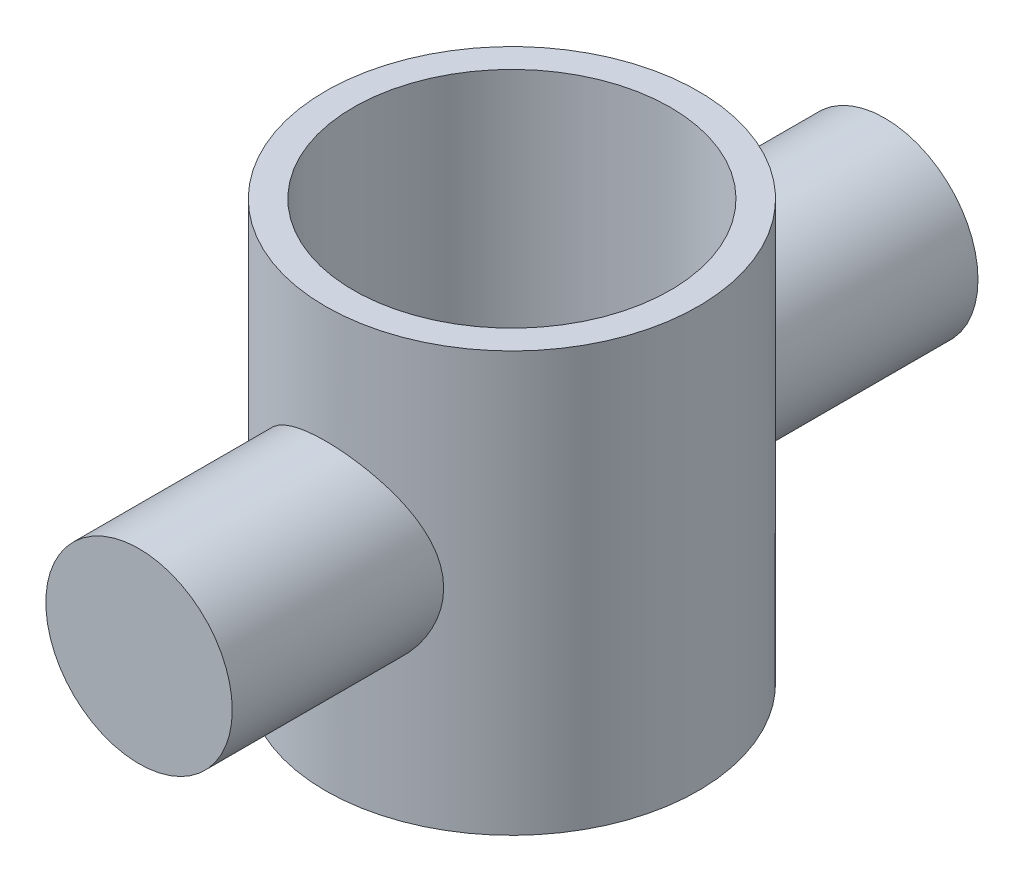
ISO-10303-21;
HEADER;
FILE_DESCRIPTION(('STEP AP214'),'2;1');
FILE_NAME('part.step','',(''),(''),'','','');
FILE_SCHEMA(('AUTOMOTIVE_DESIGN { 1 0 10303 214 1 1 1 1 }'));
ENDSEC;
DATA;
#1=APPLICATION_CONTEXT('core data for automotive mechanical design processes');
#2=APPLICATION_PROTOCOL_DEFINITION('international standard','automotive_design',2000,#1);
#3=PRODUCT_CONTEXT('',#1,'mechanical');
#4=PRODUCT('Part','Part','',(#3));
#5=PRODUCT_RELATED_PRODUCT_CATEGORY('part','',(#4));
#6=PRODUCT_DEFINITION_FORMATION('','',#4);
#7=PRODUCT_DEFINITION_CONTEXT('part definition',#1,'design');
#8=PRODUCT_DEFINITION('design','',#6,#7);
#9=PRODUCT_DEFINITION_SHAPE('','',#8);
#10=(LENGTH_UNIT() NAMED_UNIT(*) SI_UNIT(.MILLI.,.METRE.));
#11=(NAMED_UNIT(*) PLANE_ANGLE_UNIT() SI_UNIT($,.RADIAN.));
#12=(NAMED_UNIT(*) SI_UNIT($,.STERADIAN.) SOLID_ANGLE_UNIT());
#13=UNCERTAINTY_MEASURE_WITH_UNIT(LENGTH_MEASURE(1.E-05),#10,'distance_accuracy_value','');
#14=(GEOMETRIC_REPRESENTATION_CONTEXT(3) GLOBAL_UNCERTAINTY_ASSIGNED_CONTEXT((#13)) GLOBAL_UNIT_ASSIGNED_CONTEXT((#10,
#11,#12)) REPRESENTATION_CONTEXT('',''));
#15=CARTESIAN_POINT('',(0.,0.,0.));
#16=DIRECTION('',(0.,0.,1.));
#17=DIRECTION('',(1.,0.,0.));
#18=AXIS2_PLACEMENT_3D('',#15,#16,#17);
#19=CARTESIAN_POINT('',(0.,45.,0.));
#20=DIRECTION('',(0.,-1.,0.));
#21=DIRECTION('',(0.,0.,-1.));
#22=AXIS2_PLACEMENT_3D('',#19,#20,#21);
#23=CYLINDRICAL_SURFACE('',#22,20.);
#24=CARTESIAN_POINT('',(0.,0.,0.));
#25=DIRECTION('',(0.,1.,0.));
#26=DIRECTION('',(0.,0.,1.));
#27=AXIS2_PLACEMENT_3D('',#24,#25,#26);
#28=CIRCLE('',#27,20.);
#29=CARTESIAN_POINT('',(0.,0.,20.));
#30=VERTEX_POINT('',#29);
#31=EDGE_CURVE('E51',#30,#30,#28,.T.);
#32=ORIENTED_EDGE('',*,*,#31,.T.);
#33=EDGE_LOOP('',(#32));
#34=FACE_BOUND('',#33,.T.);
#35=CARTESIAN_POINT('',(0.,45.,0.));
#36=DIRECTION('',(0.,1.,0.));
#37=DIRECTION('',(0.,0.,1.));
#38=AXIS2_PLACEMENT_3D('',#35,#36,#37);
#39=CIRCLE('',#38,20.);
#40=CARTESIAN_POINT('',(0.,45.,20.));
#41=VERTEX_POINT('',#40);
#42=EDGE_CURVE('E47',#41,#41,#39,.T.);
#43=ORIENTED_EDGE('',*,*,#42,.F.);
#44=EDGE_LOOP('',(#43));
#45=FACE_BOUND('',#44,.T.);
#46=CARTESIAN_POINT('',(10.,22.5,17.3205080758025));
#47=CARTESIAN_POINT('',(9.99999887830497,22.7606630406052,17.3205095703916));
#48=CARTESIAN_POINT('',(9.98979463038328,23.0213487765862,17.326412410948));
#49=CARTESIAN_POINT('',(9.9491112521575,23.5407114771179,17.3498046872366));
#50=CARTESIAN_POINT('',(9.91862268285056,23.7993874497357,17.3672995171105));
#51=CARTESIAN_POINT('',(9.83771551508335,24.3130233815053,17.4132568469148));
#52=CARTESIAN_POINT('',(9.78726564599209,24.5679768562016,17.4417365535751));
#53=CARTESIAN_POINT('',(9.66704369384655,25.0720498819834,17.5086546907083));
#54=CARTESIAN_POINT('',(9.59726323891524,25.3211668545254,17.5470974356042));
#55=CARTESIAN_POINT('',(9.43962165536858,25.8104736808939,17.6323996319544));
#56=CARTESIAN_POINT('',(9.3518675445972,26.0507068685696,17.6792090659464));
#57=CARTESIAN_POINT('',(9.1588244034212,26.522554226848,17.7799827411094));
#58=CARTESIAN_POINT('',(9.05352901444222,26.7541652345949,17.8339495753296));
#59=CARTESIAN_POINT('',(8.82628481748421,27.2075453910227,17.947501727548));
#60=CARTESIAN_POINT('',(8.70433993726026,27.4293168446367,18.0070857193883));
#61=CARTESIAN_POINT('',(8.44458163827554,27.862159667343,18.1303531605038));
#62=CARTESIAN_POINT('',(8.3067676970442,28.073230683806,18.1940367447229));
#63=CARTESIAN_POINT('',(8.00400718236378,28.5008375300898,18.3293639025618));
#64=CARTESIAN_POINT('',(7.83775940313324,28.7163824929749,18.4012302839659));
#65=CARTESIAN_POINT('',(7.48852658774143,29.1329349102263,18.5460965168987));
#66=CARTESIAN_POINT('',(7.30554585568077,29.3339460793307,18.6190960729602));
#67=CARTESIAN_POINT('',(6.92354675195101,29.7206945636853,18.7644955635839));
#68=CARTESIAN_POINT('',(6.72451542441946,29.9064192905601,18.8368949606593));
#69=CARTESIAN_POINT('',(6.31154503654925,30.2613467831365,18.9792540720519));
#70=CARTESIAN_POINT('',(6.09761130142216,30.4305553993141,19.0492146445835));
#71=CARTESIAN_POINT('',(5.64077435797255,30.7623641319125,19.1896470662405));
#72=CARTESIAN_POINT('',(5.39689043751351,30.923739252636,19.2598322512793));
#73=CARTESIAN_POINT('',(4.89454568058587,31.2252065641405,19.3935808273393));
#74=CARTESIAN_POINT('',(4.63608400823326,31.3652975327898,19.457143838051));
#75=CARTESIAN_POINT('',(4.10635184713668,31.6227489252018,19.5757886087393));
#76=CARTESIAN_POINT('',(3.83508764837286,31.740120369577,19.6308744780711));
#77=CARTESIAN_POINT('',(3.28159286611869,31.9508629769494,19.7309453282133));
#78=CARTESIAN_POINT('',(2.99936345111385,32.0442366891839,19.7759313818453));
#79=CARTESIAN_POINT('',(2.44661617021399,32.2000287759103,19.851606101471));
#80=CARTESIAN_POINT('',(2.17669338786953,32.2641767012523,19.8830841882945));
#81=CARTESIAN_POINT('',(1.63143316165859,32.3699306679204,19.9352303439006));
#82=CARTESIAN_POINT('',(1.35609595374903,32.4115376893174,19.9558988826774));
#83=CARTESIAN_POINT('',(0.802434144208415,32.4716398194173,19.9858180043392));
#84=CARTESIAN_POINT('',(0.524111137986273,32.4901467059472,19.9950744057832));
#85=CARTESIAN_POINT('',(-0.0332441550594182,32.5038286268049,20.001913600906));
#86=CARTESIAN_POINT('',(-0.312276397444165,32.4990050886084,19.9994971087925));
#87=CARTESIAN_POINT('',(-0.844365378168994,32.4675360431046,19.9837839047871));
#88=CARTESIAN_POINT('',(-1.09756809882324,32.4428274531722,19.9714530082894));
#89=CARTESIAN_POINT('',(-1.60072224443297,32.3743173771119,19.9374335863614));
#90=CARTESIAN_POINT('',(-1.85067389701525,32.3305172351899,19.9157457197417));
#91=CARTESIAN_POINT('',(-2.34564683759178,32.2243003885798,19.8635314520883));
#92=CARTESIAN_POINT('',(-2.59066796469637,32.1618830774367,19.8330047631306));
#93=CARTESIAN_POINT('',(-3.07423071170265,32.0190690101673,19.7638249456652));
#94=CARTESIAN_POINT('',(-3.31277209853237,31.9386716082669,19.7251715252803));
#95=CARTESIAN_POINT('',(-3.78519130199608,31.7594279438287,19.6400278970963));
#96=CARTESIAN_POINT('',(-4.01896179864799,31.66034597564,19.5934383954162));
#97=CARTESIAN_POINT('',(-4.47722728597148,31.4453098003851,19.4938328204594));
#98=CARTESIAN_POINT('',(-4.70171895242548,31.3293496126871,19.4408144702995));
#99=CARTESIAN_POINT('',(-5.35951935177887,30.9574852859863,19.2738101334535));
#100=CARTESIAN_POINT('',(-5.77743819794035,30.6774883890319,19.1518214470862));
#101=CARTESIAN_POINT('',(-6.60185513585948,30.0309599928516,18.8844067887008));
#102=CARTESIAN_POINT('',(-7.00353936957576,29.6587504953409,18.7378553722978));
#103=CARTESIAN_POINT('',(-7.55658054219876,29.0553615827988,18.5185765182006));
#104=CARTESIAN_POINT('',(-7.73279224462675,28.8465480347862,18.4455210194467));
#105=CARTESIAN_POINT('',(-8.06791510127875,28.4146773262632,18.301419633553));
#106=CARTESIAN_POINT('',(-8.22682364113361,28.1916180213884,18.2303740512924));
#107=CARTESIAN_POINT('',(-8.5358678027898,27.7176662830689,18.0878347411362));
#108=CARTESIAN_POINT('',(-8.68479491189735,27.4659060892839,18.0166021936627));
#109=CARTESIAN_POINT('',(-8.96061518559181,26.9489493277867,17.8810231107787));
#110=CARTESIAN_POINT('',(-9.08751826340896,26.683758874964,17.8166734823301));
#111=CARTESIAN_POINT('',(-9.31801905264916,26.1415971008251,17.6972138879534));
#112=CARTESIAN_POINT('',(-9.42163054142461,25.8646328598081,17.6420984647839));
#113=CARTESIAN_POINT('',(-9.6043511053784,25.3007562102518,17.5432965504927));
#114=CARTESIAN_POINT('',(-9.68346352159808,25.0138451641395,17.4996085010985));
#115=CARTESIAN_POINT('',(-9.81078056043059,24.4554952673167,17.4285246280651));
#116=CARTESIAN_POINT('',(-9.86093677880257,24.1846306141781,17.4001125290245));
#117=CARTESIAN_POINT('',(-9.93878416908238,23.6386742556951,17.3557653968301));
#118=CARTESIAN_POINT('',(-9.96647661050726,23.36358279012,17.3398296585895));
#119=CARTESIAN_POINT('',(-9.99895720583358,22.8117693057902,17.3211203070706));
#120=CARTESIAN_POINT('',(-10.0037591970208,22.5350483733802,17.3183387420978));
#121=CARTESIAN_POINT('',(-9.99041751959117,21.9823571523599,17.3260388316318));
#122=CARTESIAN_POINT('',(-9.97227539979279,21.7063868143417,17.3365195908792));
#123=CARTESIAN_POINT('',(-9.91658048540383,21.1878300979978,17.3684286609912));
#124=CARTESIAN_POINT('',(-9.88137691489805,20.9449043513269,17.3885290217098));
#125=CARTESIAN_POINT('',(-9.79342893834179,20.4631581986277,17.4382137869233));
#126=CARTESIAN_POINT('',(-9.74067872486878,20.224339179364,17.4678013312798));
#127=CARTESIAN_POINT('',(-9.61821012577963,19.7523728066374,17.5355331166055));
#128=CARTESIAN_POINT('',(-9.54849400477386,19.5192247007854,17.5736762155256));
#129=CARTESIAN_POINT('',(-9.39275103363015,19.0597756536672,17.6574071681541));
#130=CARTESIAN_POINT('',(-9.30671771455237,18.833477469448,17.7029979735021));
#131=CARTESIAN_POINT('',(-9.01657018480176,18.1461619123701,17.8535843814279));
#132=CARTESIAN_POINT('',(-8.78600743614071,17.6983271944481,17.9691397733178));
#133=CARTESIAN_POINT('',(-8.26280380654966,16.8451898611981,18.2156365133563));
#134=CARTESIAN_POINT('',(-7.97013103596697,16.4399092551686,18.3465857498262));
#135=CARTESIAN_POINT('',(-7.46888401536937,15.8445899996732,18.5540860890347));
#136=CARTESIAN_POINT('',(-7.27935116096336,15.6378065903612,18.6294365394176));
#137=CARTESIAN_POINT('',(-6.88345408601396,15.2407576624266,18.7793184193873));
#138=CARTESIAN_POINT('',(-6.67709486872216,15.0504872682122,18.8538500850107));
#139=CARTESIAN_POINT('',(-6.2483870761705,14.68740551977,19.0002370989689));
#140=CARTESIAN_POINT('',(-6.02602665884121,14.5146073285191,19.0720904041641));
#141=CARTESIAN_POINT('',(-5.56664786726718,14.1878499930692,19.2111944255354));
#142=CARTESIAN_POINT('',(-5.32963579642807,14.0338828311745,19.2784470951136));
#143=CARTESIAN_POINT('',(-4.83560208581488,13.7420643454918,19.4083463032909));
#144=CARTESIAN_POINT('',(-4.57821478299396,13.6047543068838,19.4708214998895));
#145=CARTESIAN_POINT('',(-4.05082787589656,13.3525290797426,19.5873354303891));
#146=CARTESIAN_POINT('',(-3.78082784929798,13.2376146417671,19.6413738815323));
#147=CARTESIAN_POINT('',(-3.23033940659703,13.0315676034283,19.739376920925));
#148=CARTESIAN_POINT('',(-2.94985864766192,12.9404180144988,19.7833487026879));
#149=CARTESIAN_POINT('',(-2.38049331566244,12.7829809377577,19.859902273447));
#150=CARTESIAN_POINT('',(-2.09160974351614,12.7166905017605,19.8924854130546));
#151=CARTESIAN_POINT('',(-1.53480500340926,12.6148104680722,19.9427983622971));
#152=CARTESIAN_POINT('',(-1.26739371227679,12.5769613323213,19.9616170482071));
#153=CARTESIAN_POINT('',(-0.729851996972935,12.5230133013918,19.9884894545248));
#154=CARTESIAN_POINT('',(-0.459721746469678,12.5069130258186,19.9965438581382));
#155=CARTESIAN_POINT('',(0.0809759419450326,12.4966735052811,20.0016629969108));
#156=CARTESIAN_POINT('',(0.35154322558937,12.5025277174833,19.9987310062138));
#157=CARTESIAN_POINT('',(0.890971567994163,12.5361056712832,19.981966298713));
#158=CARTESIAN_POINT('',(1.15983267352025,12.5638288108298,19.9681338819976));
#159=CARTESIAN_POINT('',(1.67605139698322,12.6382400784625,19.9312153598382));
#160=CARTESIAN_POINT('',(1.92365683902697,12.6835553557227,19.9088004475415));
#161=CARTESIAN_POINT('',(2.41384547186689,12.7924575078504,19.8553300434349));
#162=CARTESIAN_POINT('',(2.65642894536399,12.8560433512008,19.824275039429));
#163=CARTESIAN_POINT('',(3.13506320786152,13.0008477412655,19.7542370428922));
#164=CARTESIAN_POINT('',(3.3711145923984,13.0820646745262,19.7152547758203));
#165=CARTESIAN_POINT('',(3.83546861690839,13.2614308709614,19.630204408981));
#166=CARTESIAN_POINT('',(4.06376823707738,13.3595866443391,19.5841335855682));
#167=CARTESIAN_POINT('',(4.52085803758578,13.5765183714333,19.4838108958391));
#168=CARTESIAN_POINT('',(4.74925902683239,13.6959918753067,19.4292950766467));
#169=CARTESIAN_POINT('',(5.19522438509806,13.951565942595,19.3148302804198));
#170=CARTESIAN_POINT('',(5.41278502410159,14.0876721742409,19.2548794530075));
#171=CARTESIAN_POINT('',(5.83606045707016,14.3755967296755,19.1308402275809));
#172=CARTESIAN_POINT('',(6.04177287148289,14.527418192644,19.0667510038712));
#173=CARTESIAN_POINT('',(6.44045588133676,14.8458750089528,18.9358010862756));
#174=CARTESIAN_POINT('',(6.63342576870329,15.0125111843094,18.8689402387122));
#175=CARTESIAN_POINT('',(7.02443076726279,15.3770952740816,18.7271146644566));
#176=CARTESIAN_POINT('',(7.22105023737883,15.5765084457706,18.6520069761565));
#177=CARTESIAN_POINT('',(7.59688252262949,15.991110204573,18.502116196358));
#178=CARTESIAN_POINT('',(7.77610015156034,16.2062943999471,18.4273330205908));
#179=CARTESIAN_POINT('',(8.116379302609,16.6516671852616,18.2800108882191));
#180=CARTESIAN_POINT('',(8.27742256849496,16.881870502147,18.2074742403918));
#181=CARTESIAN_POINT('',(8.58012843327159,17.3560212367418,18.0668000353151));
#182=CARTESIAN_POINT('',(8.72178830428031,17.5999705821638,17.9986630979608));
#183=CARTESIAN_POINT('',(8.98880823409095,18.1083744920354,17.8668466988374));
#184=CARTESIAN_POINT('',(9.11350193984871,18.3732353613376,17.8033795439941));
#185=CARTESIAN_POINT('',(9.33972032642868,18.9145283850394,17.6857538350946));
#186=CARTESIAN_POINT('',(9.44125694748974,19.1909544887671,17.6315904873885));
#187=CARTESIAN_POINT('',(9.61975104080138,19.7528111140197,17.5348420080537));
#188=CARTESIAN_POINT('',(9.69677174084387,20.0382163517741,17.4922271352654));
#189=CARTESIAN_POINT('',(9.82541504865091,20.6161855225078,17.4202953027834));
#190=CARTESIAN_POINT('',(9.87705541386039,20.9087442996144,17.390969046784));
#191=CARTESIAN_POINT('',(9.9436460319787,21.4179955523944,17.3529508814833));
#192=CARTESIAN_POINT('',(9.96475859003862,21.6336483203045,17.340814385886));
#193=CARTESIAN_POINT('',(9.99293651062061,22.0661954321323,17.324592091899));
#194=CARTESIAN_POINT('',(10.0000009334159,22.2830898581356,17.3205068320836));
#195=CARTESIAN_POINT('',(10.,22.5,17.3205080758025));
#196=B_SPLINE_CURVE_WITH_KNOTS('',3,(#46,#47,#48,#49,#50,#51,#52,#53,#54,#55,#56,#57,#58,#59,
#60,#61,#62,#63,#64,#65,#66,#67,#68,#69,#70,#71,#72,#73,#74,#75,#76,#77,#78,#79,#80,#81,#82,#83,
#84,#85,#86,#87,#88,#89,#90,#91,#92,#93,#94,#95,#96,#97,#98,#99,#100,#101,#102,#103,#104,#105,
#106,#107,#108,#109,#110,#111,#112,#113,#114,#115,#116,#117,#118,#119,#120,#121,#122,#123,#124,
#125,#126,#127,#128,#129,#130,#131,#132,#133,#134,#135,#136,#137,#138,#139,#140,#141,#142,#143,
#144,#145,#146,#147,#148,#149,#150,#151,#152,#153,#154,#155,#156,#157,#158,#159,#160,#161,#162,
#163,#164,#165,#166,#167,#168,#169,#170,#171,#172,#173,#174,#175,#176,#177,#178,#179,#180,#181,
#182,#183,#184,#185,#186,#187,#188,#189,#190,#191,#192,#193,#194,#195),.UNSPECIFIED.,.T.,.F.,(4,
2,2,2,2,2,2,2,2,2,2,2,2,2,2,2,2,2,2,2,2,2,2,2,2,2,2,2,2,2,2,2,2,2,2,2,2,2,2,2,2,2,2,2,2,2,2,2,2,
2,2,2,2,2,2,2,2,2,2,2,2,2,2,2,2,2,2,2,2,2,2,2,2,2,4),(0.,0.781764769121856,1.56389357535791,
2.34725251775105,3.13095125664508,3.91011273597781,4.68955727220855,5.46881824760789,
6.24810488661731,7.09181817841993,7.93531505493488,8.77949974189108,9.62338430105646,
10.5244589431264,11.4255853051814,12.3262734543353,13.2268658853714,14.0633930705291,
14.8998838808483,15.7359480238003,16.5719610126878,17.3351709002034,18.098327059998,
18.8615080823512,19.6247165195696,20.398289173592,21.1721366058423,22.7189130677553,
24.4119022783958,25.2596540794625,26.1075337918131,27.009565790382,27.9111907166018,
28.8122809054328,29.7132481546417,30.5428616309371,31.3724282192203,32.2014932705415,
33.0305023596741,33.7685142504105,34.5067706448086,35.244928550697,35.9833797127199,
37.5272041097232,39.0718230911199,39.9423348698616,40.8125887427817,41.6834934262136,
42.5540260036958,43.4478458060215,44.3416955583268,45.234904569292,46.1280076160918,
46.9391312005271,47.7502033007395,48.561033706047,49.3718417899955,50.129122220456,
50.8863599048826,51.6435283222767,52.4009883973782,53.1905472291839,53.9803758873275,
54.7703626224599,55.5603932185674,56.429249088731,57.2978639221947,58.1673436596877,
59.036945636034,59.9343645678694,60.8313197217708,61.7259424792823,62.6199384164635,
63.2704386348127,63.9209823658346),.UNSPECIFIED.);
#197=CARTESIAN_POINT('',(10.,22.5,17.3205080758025));
#198=VERTEX_POINT('',#197);
#199=EDGE_CURVE('E64',#198,#198,#196,.T.);
#200=ORIENTED_EDGE('',*,*,#199,.F.);
#201=EDGE_LOOP('',(#200));
#202=FACE_BOUND('',#201,.T.);
#203=CARTESIAN_POINT('',(0.,32.5,-20.));
#204=CARTESIAN_POINT('',(0.26297774757047,32.4999991311544,-19.9999992010162));
#205=CARTESIAN_POINT('',(0.52597388190779,32.4896144860554,-19.9948010837));
#206=CARTESIAN_POINT('',(1.05002923117121,32.4481941751404,-19.9741395354228));
#207=CARTESIAN_POINT('',(1.31108755349614,32.4171495254669,-19.9586716387275));
#208=CARTESIAN_POINT('',(1.82963226043826,32.3347080895986,-19.9178362229901));
#209=CARTESIAN_POINT('',(2.08711188872545,32.2832771145179,-19.8924520749392));
#210=CARTESIAN_POINT('',(2.59618182802919,32.1606617858704,-19.8324363448083));
#211=CARTESIAN_POINT('',(2.84777272531199,32.0894794078488,-19.7978056875818));
#212=CARTESIAN_POINT('',(3.34246836822569,31.9284309978279,-19.720303023444));
#213=CARTESIAN_POINT('',(3.58560245696295,31.8386391325444,-19.6774637808779));
#214=CARTESIAN_POINT('',(4.06298432085465,31.6410556783159,-19.5844658749963));
#215=CARTESIAN_POINT('',(4.29723190454895,31.5332637018277,-19.5343070540929));
#216=CARTESIAN_POINT('',(4.75551398861712,31.3006307634748,-19.4278257394007));
#217=CARTESIAN_POINT('',(4.97955221985718,31.1757960973552,-19.371505523214));
#218=CARTESIAN_POINT('',(5.41653080360957,30.9099130709816,-19.2538936046229));
#219=CARTESIAN_POINT('',(5.62946673237805,30.7688583184689,-19.1925999450287));
#220=CARTESIAN_POINT('',(6.05571153636931,30.4624954366143,-19.0625536763854));
#221=CARTESIAN_POINT('',(6.2682689260733,30.2962377965806,-18.9935741626949));
#222=CARTESIAN_POINT('',(6.67880739057353,29.9475548696851,-18.8531326273725));
#223=CARTESIAN_POINT('',(6.87678763090649,29.765128658575,-18.7816704639663));
#224=CARTESIAN_POINT('',(7.25738906236846,29.3849614203297,-18.6379106306311));
#225=CARTESIAN_POINT('',(7.44000060064986,29.1872109157941,-18.5656124675679));
#226=CARTESIAN_POINT('',(7.7888836174931,28.7773980437752,-18.4219676840917));
#227=CARTESIAN_POINT('',(7.95515202519227,28.5653329991786,-18.3506212446753));
#228=CARTESIAN_POINT('',(8.2827111057377,28.1108068013796,-18.2052535437119));
#229=CARTESIAN_POINT('',(8.44260565220417,27.8672646356158,-18.1314567024133));
#230=CARTESIAN_POINT('',(8.74109142208519,27.3660415201669,-17.9894590508883));
#231=CARTESIAN_POINT('',(8.87969167215241,27.1083666245536,-17.9212558752544));
#232=CARTESIAN_POINT('',(9.13438777848807,26.5803007968687,-17.7927881626278));
#233=CARTESIAN_POINT('',(9.25049044721743,26.3099137450612,-17.7325212242509));
#234=CARTESIAN_POINT('',(9.45894522420918,25.75811404655,-17.6222099564148));
#235=CARTESIAN_POINT('',(9.55129996419766,25.4767026255442,-17.5721644943465));
#236=CARTESIAN_POINT('',(9.70625458779874,24.9220849599405,-17.4870229092242));
#237=CARTESIAN_POINT('',(9.77030307761469,24.64939374522,-17.4512120054423));
#238=CARTESIAN_POINT('',(9.87543221046261,24.0982835344642,-17.3919377517219));
#239=CARTESIAN_POINT('',(9.91651383598184,23.8198647839724,-17.368473873599));
#240=CARTESIAN_POINT('',(9.97504777353869,23.2599854008135,-17.3349233192211));
#241=CARTESIAN_POINT('',(9.99252007209236,22.978527544653,-17.3248253281998));
#242=CARTESIAN_POINT('',(10.0036080043825,22.414997490163,-17.3184259915651));
#243=CARTESIAN_POINT('',(9.99722591425208,22.1329253530135,-17.3221233296318));
#244=CARTESIAN_POINT('',(9.96291632672931,21.6045952020966,-17.3418743842694));
#245=CARTESIAN_POINT('',(9.93766509151722,21.3580998286423,-17.3563927185974));
#246=CARTESIAN_POINT('',(9.8690882825972,20.8683607757045,-17.3954780340008));
#247=CARTESIAN_POINT('',(9.82575672853391,20.6251181996355,-17.4200483398744));
#248=CARTESIAN_POINT('',(9.72152759312325,20.1436082749706,-17.4784283554102));
#249=CARTESIAN_POINT('',(9.66063238238804,19.9053402595966,-17.5122368181421));
#250=CARTESIAN_POINT('',(9.52187989459161,19.4350464357646,-17.5880654989193));
#251=CARTESIAN_POINT('',(9.44401584795466,19.2030231602177,-17.6300889935922));
#252=CARTESIAN_POINT('',(9.27007793534026,18.7412894084719,-17.7221768246774));
#253=CARTESIAN_POINT('',(9.17362860412848,18.5117529467328,-17.7724029635355));
#254=CARTESIAN_POINT('',(8.96447979140212,18.0615618305034,-17.878810533816));
#255=CARTESIAN_POINT('',(8.85177491107832,17.8409101581057,-17.9349939421242));
#256=CARTESIAN_POINT('',(8.61087933619458,17.409438225384,-18.0518884826287));
#257=CARTESIAN_POINT('',(8.4826858636817,17.1986197381147,-18.1126004262899));
#258=CARTESIAN_POINT('',(8.21155546672611,16.7876476337912,-18.2371218065418));
#259=CARTESIAN_POINT('',(8.06861764351119,16.5874946680049,-18.3009314318325));
#260=CARTESIAN_POINT('',(7.74962298190964,16.1738683200168,-18.4384710076206));
#261=CARTESIAN_POINT('',(7.57166567582239,15.961933896661,-18.5124312542501));
#262=CARTESIAN_POINT('',(7.19890817206694,15.5536251358376,-18.6605447929763));
#263=CARTESIAN_POINT('',(7.00411219662654,15.3572469212453,-18.7346980321841));
#264=CARTESIAN_POINT('',(6.5984132459434,14.9808534192401,-18.8814062531242));
#265=CARTESIAN_POINT('',(6.38749704374536,14.8008518402429,-18.9539598580541));
#266=CARTESIAN_POINT('',(5.9507961704325,14.4585471364974,-19.0955673475654));
#267=CARTESIAN_POINT('',(5.72501741077281,14.2962370425202,-19.164622604476));
#268=CARTESIAN_POINT('',(5.24872768197162,13.9832041345111,-19.3006480329725));
#269=CARTESIAN_POINT('',(4.99755374827171,13.8333791540281,-19.3673693587667));
#270=CARTESIAN_POINT('',(4.48152997851448,13.5556307630696,-19.4932401539485));
#271=CARTESIAN_POINT('',(4.21667950634011,13.427708372514,-19.5523892706948));
#272=CARTESIAN_POINT('',(3.67526022803788,13.1952056965372,-19.6613492326779));
#273=CARTESIAN_POINT('',(3.39869900661396,13.0906105697672,-19.7111660121174));
#274=CARTESIAN_POINT('',(2.83582264507486,12.9059492211278,-19.7999810198758));
#275=CARTESIAN_POINT('',(2.54950863124167,12.8258801775116,-19.8389804926862));
#276=CARTESIAN_POINT('',(1.99360082076711,12.6969341388409,-19.9021913169255));
#277=CARTESIAN_POINT('',(1.72458658463508,12.6460227570388,-19.9273600412885));
#278=CARTESIAN_POINT('',(1.18250594424724,12.5663848419067,-19.9668602547768));
#279=CARTESIAN_POINT('',(0.909439761223921,12.53765710188,-19.9811923333691));
#280=CARTESIAN_POINT('',(0.361621452061378,12.5027736792174,-19.9986076087938));
#281=CARTESIAN_POINT('',(0.0868700440476463,12.4966089716722,-20.0016953032259));
#282=CARTESIAN_POINT('',(-0.462095284936299,12.5069111876297,-19.996544733302));
#283=CARTESIAN_POINT('',(-0.736309229155637,12.5233771095491,-19.9883069701865));
#284=CARTESIAN_POINT('',(-1.26069578442055,12.5765620616977,-19.9618171280824));
#285=CARTESIAN_POINT('',(-1.51108216427542,12.6116095728205,-19.9443921243345));
#286=CARTESIAN_POINT('',(-2.0077033463476,12.7003699951794,-19.9005341339856));
#287=CARTESIAN_POINT('',(-2.25393841461836,12.7540817054405,-19.8741017269811));
#288=CARTESIAN_POINT('',(-2.7406844611906,12.8796139920955,-19.812845023159));
#289=CARTESIAN_POINT('',(-2.98119512032807,12.9514355756276,-19.7780202596251));
#290=CARTESIAN_POINT('',(-3.4550508210735,13.1124946583728,-19.7007681992834));
#291=CARTESIAN_POINT('',(-3.68839556112771,13.2017328893482,-19.6583405830473));
#292=CARTESIAN_POINT('',(-4.15316088617015,13.3996247243195,-19.5655046555384));
#293=CARTESIAN_POINT('',(-4.38433936906094,13.508757038834,-19.5149041886911));
#294=CARTESIAN_POINT('',(-4.83663774643759,13.7437478963626,-19.4077573479828));
#295=CARTESIAN_POINT('',(-5.05775400766403,13.8696124177045,-19.3512088504371));
#296=CARTESIAN_POINT('',(-5.70436813169987,14.2709434864471,-19.1744474473865));
#297=CARTESIAN_POINT('',(-6.11337858448959,14.570253667661,-19.0470672570173));
#298=CARTESIAN_POINT('',(-6.91779518371265,15.25770054169,-18.7707873202954));
#299=CARTESIAN_POINT('',(-7.30792110762595,15.6516737079917,-18.6210027147805));
#300=CARTESIAN_POINT('',(-7.84082560671493,16.2872605585903,-18.3999640224111));
#301=CARTESIAN_POINT('',(-8.00984942409512,16.5067352134642,-18.3268393772916));
#302=CARTESIAN_POINT('',(-8.32960568094728,16.9597394427642,-18.183737266458));
#303=CARTESIAN_POINT('',(-8.4803354830786,17.1932710364541,-18.1137602554328));
#304=CARTESIAN_POINT('',(-8.76928163027866,17.6849259938434,-17.9757225676596));
#305=CARTESIAN_POINT('',(-8.90652817819507,17.9436933067517,-17.9079221139821));
#306=CARTESIAN_POINT('',(-9.15837639012035,18.4738115445517,-17.7804404562871));
#307=CARTESIAN_POINT('',(-9.27298894306127,18.7451563406136,-17.7207553524022));
#308=CARTESIAN_POINT('',(-9.47827705930681,19.2985498632991,-17.6118078617936));
#309=CARTESIAN_POINT('',(-9.56897185129601,19.5805897816227,-17.5625371088176));
#310=CARTESIAN_POINT('',(-9.72530086409336,20.1533832153516,-17.4764560330943));
#311=CARTESIAN_POINT('',(-9.79093896514153,20.4441353740658,-17.4396437811433));
#312=CARTESIAN_POINT('',(-9.89107565144743,21.0035247967187,-17.3830260812378));
#313=CARTESIAN_POINT('',(-9.92795857968716,21.2716057546725,-17.3619273114046));
#314=CARTESIAN_POINT('',(-9.97987692141645,21.8105606593007,-17.332136815937));
#315=CARTESIAN_POINT('',(-9.99491382071395,22.0814344147671,-17.3234442465237));
#316=CARTESIAN_POINT('',(-10.0029096686844,22.6235135688981,-17.3188284226879));
#317=CARTESIAN_POINT('',(-9.9958767833924,22.8947188077901,-17.3229004452416));
#318=CARTESIAN_POINT('',(-9.95985898725887,23.4351721097639,-17.3436339919872));
#319=CARTESIAN_POINT('',(-9.93087497508662,23.7044202525128,-17.3602950007916));
#320=CARTESIAN_POINT('',(-9.85519722920277,24.2131144453934,-17.4033551463061));
#321=CARTESIAN_POINT('',(-9.81046230963215,24.4529480089251,-17.4286705637748));
#322=CARTESIAN_POINT('',(-9.70388285528388,24.9277291978268,-17.4882355534742));
#323=CARTESIAN_POINT('',(-9.64203265928581,25.1626751788365,-17.5224880816187));
#324=CARTESIAN_POINT('',(-9.50186064219782,25.626223616403,-17.5988921487312));
#325=CARTESIAN_POINT('',(-9.42354151869526,25.8548271049183,-17.6410423939411));
#326=CARTESIAN_POINT('',(-9.25107208633864,26.3046984883442,-17.7320944008379));
#327=CARTESIAN_POINT('',(-9.15691467555994,26.5259630389356,-17.7809991895098));
#328=CARTESIAN_POINT('',(-8.94668289722953,26.9746258921229,-17.8877520145129));
#329=CARTESIAN_POINT('',(-8.82956366921284,27.2014441786001,-17.9459794825375));
#330=CARTESIAN_POINT('',(-8.57895403368727,27.644545430872,-18.067122458149));
#331=CARTESIAN_POINT('',(-8.44546216273868,27.8608274524837,-18.130038384608));
#332=CARTESIAN_POINT('',(-8.16285657798003,28.2820513773595,-18.2590224525038));
#333=CARTESIAN_POINT('',(-8.0137373905154,28.4869892685381,-18.3250916939848));
#334=CARTESIAN_POINT('',(-7.70065351710477,28.8846685995703,-18.4588439084551));
#335=CARTESIAN_POINT('',(-7.53668670721057,29.0774082877534,-18.5265271112979));
#336=CARTESIAN_POINT('',(-7.17380336462424,29.4725890708702,-18.6702735648096));
#337=CARTESIAN_POINT('',(-6.97306234663123,29.6733531745623,-18.746353564782));
#338=CARTESIAN_POINT('',(-6.55492133587247,30.057351407736,-18.8966226391637));
#339=CARTESIAN_POINT('',(-6.33752607360945,30.2405904820546,-18.9708122426046));
#340=CARTESIAN_POINT('',(-5.88693376044406,30.5885782201041,-19.1154396310611));
#341=CARTESIAN_POINT('',(-5.65372458790795,30.7533124366426,-19.1858744624017));
#342=CARTESIAN_POINT('',(-5.1728954421103,31.0628791276405,-19.3210638569054));
#343=CARTESIAN_POINT('',(-4.92527630037179,31.20771274884,-19.3858187472881));
#344=CARTESIAN_POINT('',(-4.41518835199794,31.4771882779968,-19.5083417849818));
#345=CARTESIAN_POINT('',(-4.15262447046932,31.601675330338,-19.5660555714726));
#346=CARTESIAN_POINT('',(-3.61607511779453,31.8278473632244,-19.6722841833782));
#347=CARTESIAN_POINT('',(-3.34209105214395,31.9295351399349,-19.7208001367275));
#348=CARTESIAN_POINT('',(-2.78539452130532,32.1086874933069,-19.8070877528213));
#349=CARTESIAN_POINT('',(-2.50270444198693,32.1862092878952,-19.8448847753657));
#350=CARTESIAN_POINT('',(-1.93047321727417,32.3162760900685,-19.908692874149));
#351=CARTESIAN_POINT('',(-1.64093637072212,32.3688363547921,-19.9347111494098));
#352=CARTESIAN_POINT('',(-1.12608352412093,32.4389489035084,-19.9695276660452));
#353=CARTESIAN_POINT('',(-0.901651680276706,32.461823466314,-19.9809348086311));
#354=CARTESIAN_POINT('',(-0.451484431282408,32.4923495975715,-19.9961714231232));
#355=CARTESIAN_POINT('',(-0.225748990324602,32.5000007458465,-20.0000006858747));
#356=CARTESIAN_POINT('',(0.,32.5,-20.));
#357=B_SPLINE_CURVE_WITH_KNOTS('',3,(#203,#204,#205,#206,#207,#208,#209,#210,#211,#212,#213,
#214,#215,#216,#217,#218,#219,#220,#221,#222,#223,#224,#225,#226,#227,#228,#229,#230,#231,#232,
#233,#234,#235,#236,#237,#238,#239,#240,#241,#242,#243,#244,#245,#246,#247,#248,#249,#250,#251,
#252,#253,#254,#255,#256,#257,#258,#259,#260,#261,#262,#263,#264,#265,#266,#267,#268,#269,#270,
#271,#272,#273,#274,#275,#276,#277,#278,#279,#280,#281,#282,#283,#284,#285,#286,#287,#288,#289,
#290,#291,#292,#293,#294,#295,#296,#297,#298,#299,#300,#301,#302,#303,#304,#305,#306,#307,#308,
#309,#310,#311,#312,#313,#314,#315,#316,#317,#318,#319,#320,#321,#322,#323,#324,#325,#326,#327,
#328,#329,#330,#331,#332,#333,#334,#335,#336,#337,#338,#339,#340,#341,#342,#343,#344,#345,#346,
#347,#348,#349,#350,#351,#352,#353,#354,#355,#356),.UNSPECIFIED.,.T.,.F.,(4,2,2,2,2,2,2,2,2,2,2,
2,2,2,2,2,2,2,2,2,2,2,2,2,2,2,2,2,2,2,2,2,2,2,2,2,2,2,2,2,2,2,2,2,2,2,2,2,2,2,2,2,2,2,2,2,2,2,2,
2,2,2,2,2,2,2,2,2,2,2,2,2,2,2,2,2,4),(0.,0.788710589250998,1.57776436803951,2.36814706638946,
3.15845073874465,3.94566328103175,4.73289277422682,5.51983223968626,6.30708290401819,
7.14179607204602,7.9765569858161,8.81183834708133,9.64727635829487,10.5477781072242,
11.447897073936,12.3477430494904,13.2474892618302,14.0934532489038,14.9393810441651,
15.7845922682139,16.6297228461314,17.3734776288846,18.1174786157194,18.8613792297722,
19.6055771618311,20.3667813084854,21.1282388516736,21.889833169209,22.6514739387577,
23.509891476961,24.3680943913845,25.2270091977564,26.0855844184835,26.9843425878092,
27.8831425974923,28.781369127958,29.679492277851,30.5032194900487,31.3269018918016,
32.1502547956571,32.9735712608452,33.7329722323226,34.4923243480979,35.2517187027837,
36.0111449703724,36.7921013676949,37.5733375502822,39.1349970223263,40.8500130119071,
41.7087612506847,42.5676331434658,43.4684238669888,44.3687801699595,45.2684104094407,
46.1679012770191,46.9810473193187,47.7941380547514,48.606927974181,49.4196846201562,
50.1547113408423,50.889981477547,51.6251312717133,52.3606115917998,53.1452977478639,
53.9300540928963,54.7150862327854,55.5002308492403,56.3809909668478,57.2615018327172,
58.1426954259119,59.0238382204153,59.9114030040692,60.7988588747469,61.6841972652664,
62.5689938151569,63.2460309664337,63.9230868041488),.UNSPECIFIED.);
#358=CARTESIAN_POINT('',(0.,32.5,-20.));
#359=VERTEX_POINT('',#358);
#360=EDGE_CURVE('E10',#359,#359,#357,.T.);
#361=ORIENTED_EDGE('',*,*,#360,.F.);
#362=EDGE_LOOP('',(#361));
#363=FACE_BOUND('',#362,.T.);
#364=ADVANCED_FACE('F37',(#34,#45,#202,#363),#23,.T.);
#365=CARTESIAN_POINT('',(0.,45.,0.));
#366=DIRECTION('',(0.,1.,0.));
#367=DIRECTION('',(0.,0.,1.));
#368=AXIS2_PLACEMENT_3D('',#365,#366,#367);
#369=PLANE('',#368);
#370=ORIENTED_EDGE('',*,*,#42,.T.);
#371=EDGE_LOOP('',(#370));
#372=FACE_BOUND('',#371,.T.);
#373=CARTESIAN_POINT('',(0.,45.,0.));
#374=DIRECTION('',(0.,1.,0.));
#375=DIRECTION('',(0.,0.,1.));
#376=AXIS2_PLACEMENT_3D('',#373,#374,#375);
#377=CIRCLE('',#376,17.);
#378=CARTESIAN_POINT('',(0.,45.,-17.));
#379=VERTEX_POINT('',#378);
#380=EDGE_CURVE('E56',#379,#379,#377,.T.);
#381=ORIENTED_EDGE('',*,*,#380,.F.);
#382=EDGE_LOOP('',(#381));
#383=FACE_BOUND('',#382,.T.);
#384=ADVANCED_FACE('F96',(#372,#383),#369,.T.);
#385=CARTESIAN_POINT('',(0.,0.,0.));
#386=DIRECTION('',(0.,1.,0.));
#387=DIRECTION('',(0.,0.,1.));
#388=AXIS2_PLACEMENT_3D('',#385,#386,#387);
#389=PLANE('',#388);
#390=ORIENTED_EDGE('',*,*,#31,.F.);
#391=EDGE_LOOP('',(#390));
#392=FACE_BOUND('',#391,.T.);
#393=CARTESIAN_POINT('',(0.,0.,0.));
#394=DIRECTION('',(0.,1.,0.));
#395=DIRECTION('',(0.,0.,1.));
#396=AXIS2_PLACEMENT_3D('',#393,#394,#395);
#397=CIRCLE('',#396,17.);
#398=CARTESIAN_POINT('',(0.,0.,-17.));
#399=VERTEX_POINT('',#398);
#400=EDGE_CURVE('E58',#399,#399,#397,.T.);
#401=ORIENTED_EDGE('',*,*,#400,.T.);
#402=EDGE_LOOP('',(#401));
#403=FACE_BOUND('',#402,.T.);
#404=ADVANCED_FACE('F101',(#392,#403),#389,.F.);
#405=CARTESIAN_POINT('',(0.,45.,0.));
#406=DIRECTION('',(0.,-1.,0.));
#407=DIRECTION('',(0.,0.,-1.));
#408=AXIS2_PLACEMENT_3D('',#405,#406,#407);
#409=CYLINDRICAL_SURFACE('',#408,17.);
#410=CARTESIAN_POINT('',(0.,45.,-17.));
#411=CARTESIAN_POINT('',(0.,44.53125,-17.));
#412=CARTESIAN_POINT('',(0.,44.0625,-17.));
#413=CARTESIAN_POINT('',(0.,43.125,-17.));
#414=CARTESIAN_POINT('',(0.,42.65625,-17.));
#415=CARTESIAN_POINT('',(0.,41.71875,-17.));
#416=CARTESIAN_POINT('',(0.,41.25,-17.));
#417=CARTESIAN_POINT('',(0.,40.3125,-17.));
#418=CARTESIAN_POINT('',(0.,39.84375,-17.));
#419=CARTESIAN_POINT('',(0.,38.90625,-17.));
#420=CARTESIAN_POINT('',(0.,38.4375,-17.));
#421=CARTESIAN_POINT('',(0.,37.5,-17.));
#422=CARTESIAN_POINT('',(0.,37.03125,-17.));
#423=CARTESIAN_POINT('',(0.,36.09375,-17.));
#424=CARTESIAN_POINT('',(0.,35.625,-17.));
#425=CARTESIAN_POINT('',(0.,34.6875,-17.));
#426=CARTESIAN_POINT('',(0.,34.21875,-17.));
#427=CARTESIAN_POINT('',(0.,33.28125,-17.));
#428=CARTESIAN_POINT('',(0.,32.8125,-17.));
#429=CARTESIAN_POINT('',(0.,31.875,-17.));
#430=CARTESIAN_POINT('',(0.,31.40625,-17.));
#431=CARTESIAN_POINT('',(0.,30.46875,-17.));
#432=CARTESIAN_POINT('',(0.,30.,-17.));
#433=CARTESIAN_POINT('',(0.,29.0625,-17.));
#434=CARTESIAN_POINT('',(0.,28.59375,-17.));
#435=CARTESIAN_POINT('',(0.,27.65625,-17.));
#436=CARTESIAN_POINT('',(0.,27.1875,-17.));
#437=CARTESIAN_POINT('',(0.,26.25,-17.));
#438=CARTESIAN_POINT('',(0.,25.78125,-17.));
#439=CARTESIAN_POINT('',(0.,24.84375,-17.));
#440=CARTESIAN_POINT('',(0.,24.375,-17.));
#441=CARTESIAN_POINT('',(0.,23.4375,-17.));
#442=CARTESIAN_POINT('',(0.,22.96875,-17.));
#443=CARTESIAN_POINT('',(0.,22.03125,-17.));
#444=CARTESIAN_POINT('',(0.,21.5625,-17.));
#445=CARTESIAN_POINT('',(0.,20.625,-17.));
#446=CARTESIAN_POINT('',(0.,20.15625,-17.));
#447=CARTESIAN_POINT('',(0.,19.21875,-17.));
#448=CARTESIAN_POINT('',(0.,18.75,-17.));
#449=CARTESIAN_POINT('',(0.,17.8125,-17.));
#450=CARTESIAN_POINT('',(0.,17.34375,-17.));
#451=CARTESIAN_POINT('',(0.,16.40625,-17.));
#452=CARTESIAN_POINT('',(0.,15.9375,-17.));
#453=CARTESIAN_POINT('',(0.,15.,-17.));
#454=CARTESIAN_POINT('',(0.,14.53125,-17.));
#455=CARTESIAN_POINT('',(0.,13.59375,-17.));
#456=CARTESIAN_POINT('',(0.,13.125,-17.));
#457=CARTESIAN_POINT('',(0.,12.1875,-17.));
#458=CARTESIAN_POINT('',(0.,11.71875,-17.));
#459=CARTESIAN_POINT('',(0.,10.78125,-17.));
#460=CARTESIAN_POINT('',(0.,10.3125,-17.));
#461=CARTESIAN_POINT('',(0.,9.37499999999999,-17.));
#462=CARTESIAN_POINT('',(0.,8.90624999999999,-17.));
#463=CARTESIAN_POINT('',(0.,7.96874999999999,-17.));
#464=CARTESIAN_POINT('',(0.,7.5,-17.));
#465=CARTESIAN_POINT('',(0.,6.56249999999999,-17.));
#466=CARTESIAN_POINT('',(0.,6.09374999999999,-17.));
#467=CARTESIAN_POINT('',(0.,5.15624999999999,-17.));
#468=CARTESIAN_POINT('',(0.,4.68749999999999,-17.));
#469=CARTESIAN_POINT('',(0.,3.74999999999999,-17.));
#470=CARTESIAN_POINT('',(0.,3.28124999999999,-17.));
#471=CARTESIAN_POINT('',(0.,2.34374999999999,-17.));
#472=CARTESIAN_POINT('',(0.,1.87499999999999,-17.));
#473=CARTESIAN_POINT('',(0.,0.937499999999992,-17.));
#474=CARTESIAN_POINT('',(0.,0.468749999999993,-17.));
#475=CARTESIAN_POINT('',(0.,0.,-17.));
#476=B_SPLINE_CURVE_WITH_KNOTS('',3,(#410,#411,#412,#413,#414,#415,#416,#417,#418,#419,#420,
#421,#422,#423,#424,#425,#426,#427,#428,#429,#430,#431,#432,#433,#434,#435,#436,#437,#438,#439,
#440,#441,#442,#443,#444,#445,#446,#447,#448,#449,#450,#451,#452,#453,#454,#455,#456,#457,#458,
#459,#460,#461,#462,#463,#464,#465,#466,#467,#468,#469,#470,#471,#472,#473,#474,#475),
.UNSPECIFIED.,.F.,.F.,(4,2,2,2,2,2,2,2,2,2,2,2,2,2,2,2,2,2,2,2,2,2,2,2,2,2,2,2,2,2,2,2,4),(0.,
1.40625,2.8125,4.21874999999999,5.625,7.03125,8.43749999999999,9.84375,11.25,12.65625,14.0625,
15.46875,16.875,18.28125,19.6875,21.09375,22.5,23.90625,25.3125,26.71875,28.125,29.53125,
30.9375,32.34375,33.75,35.15625,36.5625,37.96875,39.375,40.78125,42.1875,43.59375,45.),.UNSPECIFIED.);
#477=EDGE_CURVE('BSEAM80',#379,#399,#476,.T.);
#478=ORIENTED_EDGE('',*,*,#380,.T.);
#479=ORIENTED_EDGE('',*,*,#400,.F.);
#480=ORIENTED_EDGE('',*,*,#477,.T.);
#481=ORIENTED_EDGE('',*,*,#477,.F.);
#482=EDGE_LOOP('',(#478,#480,#479,#481));
#483=FACE_BOUND('',#482,.T.);
#484=ADVANCED_FACE('F80',(#483),#409,.F.);
#485=CARTESIAN_POINT('',(0.,22.5,40.));
#486=DIRECTION('',(0.,0.,1.));
#487=DIRECTION('',(1.,0.,0.));
#488=AXIS2_PLACEMENT_3D('',#485,#486,#487);
#489=PLANE('',#488);
#490=CARTESIAN_POINT('',(0.,22.5,40.));
#491=DIRECTION('',(0.,0.,1.));
#492=DIRECTION('',(1.,0.,0.));
#493=AXIS2_PLACEMENT_3D('',#490,#491,#492);
#494=CIRCLE('',#493,10.);
#495=CARTESIAN_POINT('',(10.,22.5,40.));
#496=VERTEX_POINT('',#495);
#497=EDGE_CURVE('E61',#496,#496,#494,.T.);
#498=ORIENTED_EDGE('',*,*,#497,.T.);
#499=EDGE_LOOP('',(#498));
#500=FACE_BOUND('',#499,.T.);
#501=ADVANCED_FACE('F78',(#500),#489,.T.);
#502=CARTESIAN_POINT('',(0.,22.5,-500000.));
#503=DIRECTION('',(0.,0.,1.));
#504=DIRECTION('',(1.,0.,0.));
#505=AXIS2_PLACEMENT_3D('',#502,#503,#504);
#506=CYLINDRICAL_SURFACE('',#505,10.);
#507=ORIENTED_EDGE('',*,*,#497,.F.);
#508=EDGE_LOOP('',(#507));
#509=FACE_BOUND('',#508,.T.);
#510=ORIENTED_EDGE('',*,*,#199,.T.);
#511=EDGE_LOOP('',(#510));
#512=FACE_BOUND('',#511,.T.);
#513=ADVANCED_FACE('F73',(#509,#512),#506,.T.);
#514=CARTESIAN_POINT('',(0.,22.5,-40.));
#515=DIRECTION('',(0.,0.,-1.));
#516=DIRECTION('',(1.,0.,0.));
#517=AXIS2_PLACEMENT_3D('',#514,#515,#516);
#518=PLANE('',#517);
#519=CARTESIAN_POINT('',(0.,22.5,-40.));
#520=DIRECTION('',(0.,0.,1.));
#521=DIRECTION('',(1.,0.,0.));
#522=AXIS2_PLACEMENT_3D('',#519,#520,#521);
#523=CIRCLE('',#522,10.);
#524=CARTESIAN_POINT('',(10.,22.5,-40.));
#525=VERTEX_POINT('',#524);
#526=EDGE_CURVE('E71',#525,#525,#523,.T.);
#527=ORIENTED_EDGE('',*,*,#526,.F.);
#528=EDGE_LOOP('',(#527));
#529=FACE_BOUND('',#528,.T.);
#530=ADVANCED_FACE('F86',(#529),#518,.T.);
#531=CARTESIAN_POINT('',(0.,22.5,500000.));
#532=DIRECTION('',(0.,0.,-1.));
#533=DIRECTION('',(-1.,0.,0.));
#534=AXIS2_PLACEMENT_3D('',#531,#532,#533);
#535=CYLINDRICAL_SURFACE('',#534,10.);
#536=ORIENTED_EDGE('',*,*,#526,.T.);
#537=EDGE_LOOP('',(#536));
#538=FACE_BOUND('',#537,.T.);
#539=ORIENTED_EDGE('',*,*,#360,.T.);
#540=EDGE_LOOP('',(#539));
#541=FACE_BOUND('',#540,.T.);
#542=ADVANCED_FACE('F82',(#538,#541),#535,.T.);
#543=CLOSED_SHELL('',(#364,#384,#404,#484,#501,#513,#530,#542));
#544=MANIFOLD_SOLID_BREP('B2',#543);
#545=ADVANCED_BREP_SHAPE_REPRESENTATION('',(#18,#544),#14);
#546=SHAPE_DEFINITION_REPRESENTATION(#9,#545);
ENDSEC;
END-ISO-10303-21;
